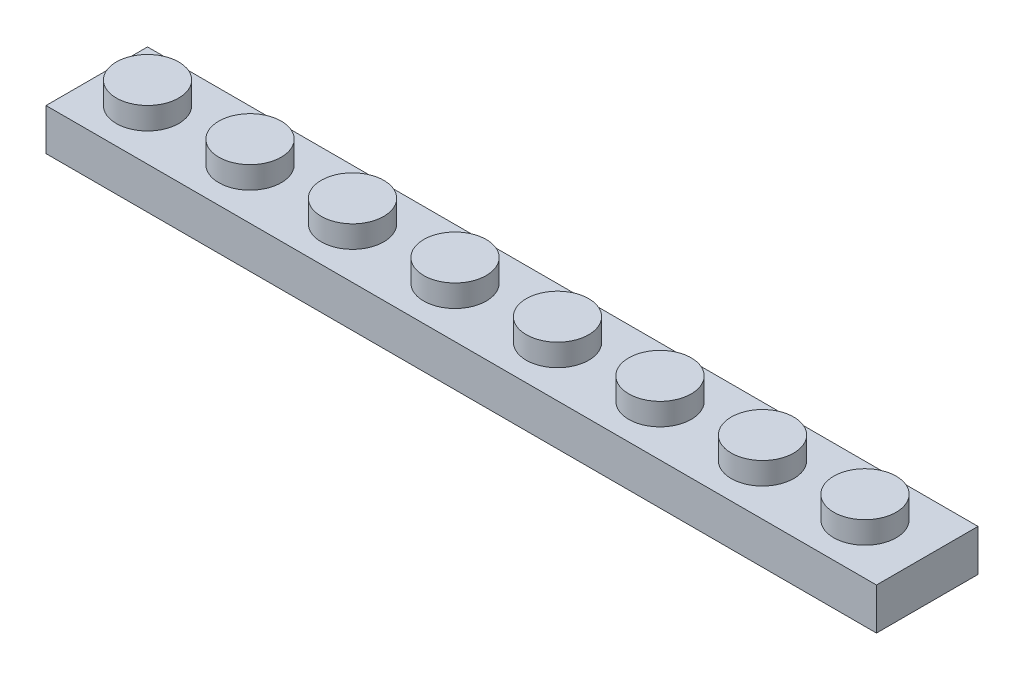
ISO-10303-21;
HEADER;
FILE_DESCRIPTION(('STEP AP214'),'2;1');
FILE_NAME('part.step','',(''),(''),'','','');
FILE_SCHEMA(('AUTOMOTIVE_DESIGN { 1 0 10303 214 1 1 1 1 }'));
ENDSEC;
DATA;
#1=APPLICATION_CONTEXT('core data for automotive mechanical design processes');
#2=APPLICATION_PROTOCOL_DEFINITION('international standard','automotive_design',2000,#1);
#3=PRODUCT_CONTEXT('',#1,'mechanical');
#4=PRODUCT('Part','Part','',(#3));
#5=PRODUCT_RELATED_PRODUCT_CATEGORY('part','',(#4));
#6=PRODUCT_DEFINITION_FORMATION('','',#4);
#7=PRODUCT_DEFINITION_CONTEXT('part definition',#1,'design');
#8=PRODUCT_DEFINITION('design','',#6,#7);
#9=PRODUCT_DEFINITION_SHAPE('','',#8);
#10=(LENGTH_UNIT() NAMED_UNIT(*) SI_UNIT(.MILLI.,.METRE.));
#11=(NAMED_UNIT(*) PLANE_ANGLE_UNIT() SI_UNIT($,.RADIAN.));
#12=(NAMED_UNIT(*) SI_UNIT($,.STERADIAN.) SOLID_ANGLE_UNIT());
#13=UNCERTAINTY_MEASURE_WITH_UNIT(LENGTH_MEASURE(1.E-05),#10,'distance_accuracy_value','');
#14=(GEOMETRIC_REPRESENTATION_CONTEXT(3) GLOBAL_UNCERTAINTY_ASSIGNED_CONTEXT((#13)) GLOBAL_UNIT_ASSIGNED_CONTEXT((#10,
#11,#12)) REPRESENTATION_CONTEXT('',''));
#15=CARTESIAN_POINT('',(0.,0.,0.));
#16=DIRECTION('',(0.,0.,1.));
#17=DIRECTION('',(1.,0.,0.));
#18=AXIS2_PLACEMENT_3D('',#15,#16,#17);
#19=CARTESIAN_POINT('',(-31.9,3.2,3.9));
#20=DIRECTION('',(1.,0.,0.));
#21=DIRECTION('',(0.,0.,-1.));
#22=AXIS2_PLACEMENT_3D('',#19,#20,#21);
#23=PLANE('',#22);
#24=DIRECTION('',(0.,0.,1.));
#25=VECTOR('',#24,1.);
#26=CARTESIAN_POINT('',(-31.9,0.,3.9));
#27=LINE('',#26,#25);
#28=CARTESIAN_POINT('',(-31.9,0.,-3.89999999999999));
#29=VERTEX_POINT('',#28);
#30=CARTESIAN_POINT('',(-31.9,0.,3.9));
#31=VERTEX_POINT('',#30);
#32=EDGE_CURVE('E96',#29,#31,#27,.T.);
#33=ORIENTED_EDGE('',*,*,#32,.T.);
#34=DIRECTION('',(0.,-1.,0.));
#35=VECTOR('',#34,1.);
#36=CARTESIAN_POINT('',(-31.9,3.2,3.9));
#37=LINE('',#36,#35);
#38=CARTESIAN_POINT('',(-31.9,3.2,3.9));
#39=VERTEX_POINT('',#38);
#40=EDGE_CURVE('E11',#39,#31,#37,.T.);
#41=ORIENTED_EDGE('',*,*,#40,.F.);
#42=DIRECTION('',(0.,0.,1.));
#43=VECTOR('',#42,1.);
#44=CARTESIAN_POINT('',(-31.9,3.2,3.9));
#45=LINE('',#44,#43);
#46=CARTESIAN_POINT('',(-31.9,3.2,-3.89999999999999));
#47=VERTEX_POINT('',#46);
#48=EDGE_CURVE('E84',#47,#39,#45,.T.);
#49=ORIENTED_EDGE('',*,*,#48,.F.);
#50=DIRECTION('',(0.,-1.,0.));
#51=VECTOR('',#50,1.);
#52=CARTESIAN_POINT('',(-31.9,3.2,-3.89999999999999));
#53=LINE('',#52,#51);
#54=EDGE_CURVE('E92',#47,#29,#53,.T.);
#55=ORIENTED_EDGE('',*,*,#54,.T.);
#56=EDGE_LOOP('',(#33,#41,#49,#55));
#57=FACE_BOUND('',#56,.T.);
#58=ADVANCED_FACE('F33',(#57),#23,.F.);
#59=CARTESIAN_POINT('',(31.9,3.2,3.9));
#60=DIRECTION('',(0.,0.,-1.));
#61=DIRECTION('',(-1.,0.,0.));
#62=AXIS2_PLACEMENT_3D('',#59,#60,#61);
#63=PLANE('',#62);
#64=DIRECTION('',(1.,0.,0.));
#65=VECTOR('',#64,1.);
#66=CARTESIAN_POINT('',(31.9,0.,3.9));
#67=LINE('',#66,#65);
#68=CARTESIAN_POINT('',(31.9,0.,3.9));
#69=VERTEX_POINT('',#68);
#70=EDGE_CURVE('E88',#31,#69,#67,.T.);
#71=ORIENTED_EDGE('',*,*,#70,.T.);
#72=DIRECTION('',(0.,-1.,0.));
#73=VECTOR('',#72,1.);
#74=CARTESIAN_POINT('',(31.9,3.2,3.9));
#75=LINE('',#74,#73);
#76=CARTESIAN_POINT('',(31.9,3.2,3.9));
#77=VERTEX_POINT('',#76);
#78=EDGE_CURVE('E41',#77,#69,#75,.T.);
#79=ORIENTED_EDGE('',*,*,#78,.F.);
#80=DIRECTION('',(1.,0.,0.));
#81=VECTOR('',#80,1.);
#82=CARTESIAN_POINT('',(31.9,3.2,3.9));
#83=LINE('',#82,#81);
#84=EDGE_CURVE('E79',#39,#77,#83,.T.);
#85=ORIENTED_EDGE('',*,*,#84,.F.);
#86=ORIENTED_EDGE('',*,*,#40,.T.);
#87=EDGE_LOOP('',(#71,#79,#85,#86));
#88=FACE_BOUND('',#87,.T.);
#89=ADVANCED_FACE('F87',(#88),#63,.F.);
#90=CARTESIAN_POINT('',(31.9,3.2,3.9));
#91=DIRECTION('',(-1.,0.,0.));
#92=DIRECTION('',(0.,0.,1.));
#93=AXIS2_PLACEMENT_3D('',#90,#91,#92);
#94=PLANE('',#93);
#95=DIRECTION('',(0.,0.,-1.));
#96=VECTOR('',#95,1.);
#97=CARTESIAN_POINT('',(31.9,0.,3.9));
#98=LINE('',#97,#96);
#99=CARTESIAN_POINT('',(31.9,0.,-3.9));
#100=VERTEX_POINT('',#99);
#101=EDGE_CURVE('E66',#69,#100,#98,.T.);
#102=ORIENTED_EDGE('',*,*,#101,.T.);
#103=DIRECTION('',(0.,-1.,0.));
#104=VECTOR('',#103,1.);
#105=CARTESIAN_POINT('',(31.9,3.2,-3.9));
#106=LINE('',#105,#104);
#107=CARTESIAN_POINT('',(31.9,3.2,-3.9));
#108=VERTEX_POINT('',#107);
#109=EDGE_CURVE('E89',#108,#100,#106,.T.);
#110=ORIENTED_EDGE('',*,*,#109,.F.);
#111=DIRECTION('',(0.,0.,-1.));
#112=VECTOR('',#111,1.);
#113=CARTESIAN_POINT('',(31.9,3.2,3.9));
#114=LINE('',#113,#112);
#115=EDGE_CURVE('E82',#77,#108,#114,.T.);
#116=ORIENTED_EDGE('',*,*,#115,.F.);
#117=ORIENTED_EDGE('',*,*,#78,.T.);
#118=EDGE_LOOP('',(#102,#110,#116,#117));
#119=FACE_BOUND('',#118,.T.);
#120=ADVANCED_FACE('F90',(#119),#94,.F.);
#121=CARTESIAN_POINT('',(31.9,3.2,-3.9));
#122=DIRECTION('',(0.,0.,1.));
#123=DIRECTION('',(1.,0.,0.));
#124=AXIS2_PLACEMENT_3D('',#121,#122,#123);
#125=PLANE('',#124);
#126=DIRECTION('',(-1.,0.,0.));
#127=VECTOR('',#126,1.);
#128=CARTESIAN_POINT('',(31.9,0.,-3.9));
#129=LINE('',#128,#127);
#130=EDGE_CURVE('E72',#100,#29,#129,.T.);
#131=ORIENTED_EDGE('',*,*,#130,.T.);
#132=ORIENTED_EDGE('',*,*,#54,.F.);
#133=DIRECTION('',(-1.,0.,0.));
#134=VECTOR('',#133,1.);
#135=CARTESIAN_POINT('',(31.9,3.2,-3.9));
#136=LINE('',#135,#134);
#137=EDGE_CURVE('E49',#108,#47,#136,.T.);
#138=ORIENTED_EDGE('',*,*,#137,.F.);
#139=ORIENTED_EDGE('',*,*,#109,.T.);
#140=EDGE_LOOP('',(#131,#132,#138,#139));
#141=FACE_BOUND('',#140,.T.);
#142=ADVANCED_FACE('F104',(#141),#125,.F.);
#143=CARTESIAN_POINT('',(0.,3.2,0.));
#144=DIRECTION('',(0.,1.,0.));
#145=DIRECTION('',(0.,0.,1.));
#146=AXIS2_PLACEMENT_3D('',#143,#144,#145);
#147=PLANE('',#146);
#148=CARTESIAN_POINT('',(27.118,3.2,0.));
#149=DIRECTION('',(0.,1.,0.));
#150=DIRECTION('',(0.,0.,1.));
#151=AXIS2_PLACEMENT_3D('',#148,#149,#150);
#152=CIRCLE('',#151,2.4);
#153=CARTESIAN_POINT('',(27.118,3.2,2.4));
#154=VERTEX_POINT('',#153);
#155=EDGE_CURVE('E152',#154,#154,#152,.T.);
#156=ORIENTED_EDGE('',*,*,#155,.F.);
#157=EDGE_LOOP('',(#156));
#158=FACE_BOUND('',#157,.T.);
#159=CARTESIAN_POINT('',(19.244,3.2,0.));
#160=DIRECTION('',(0.,1.,0.));
#161=DIRECTION('',(0.,0.,1.));
#162=AXIS2_PLACEMENT_3D('',#159,#160,#161);
#163=CIRCLE('',#162,2.4);
#164=CARTESIAN_POINT('',(19.244,3.2,2.4));
#165=VERTEX_POINT('',#164);
#166=EDGE_CURVE('E146',#165,#165,#163,.T.);
#167=ORIENTED_EDGE('',*,*,#166,.F.);
#168=EDGE_LOOP('',(#167));
#169=FACE_BOUND('',#168,.T.);
#170=CARTESIAN_POINT('',(11.37,3.2,0.));
#171=DIRECTION('',(0.,1.,0.));
#172=DIRECTION('',(0.,0.,1.));
#173=AXIS2_PLACEMENT_3D('',#170,#171,#172);
#174=CIRCLE('',#173,2.4);
#175=CARTESIAN_POINT('',(11.37,3.2,2.4));
#176=VERTEX_POINT('',#175);
#177=EDGE_CURVE('E140',#176,#176,#174,.T.);
#178=ORIENTED_EDGE('',*,*,#177,.F.);
#179=EDGE_LOOP('',(#178));
#180=FACE_BOUND('',#179,.T.);
#181=CARTESIAN_POINT('',(3.49600000000003,3.2,0.));
#182=DIRECTION('',(0.,1.,0.));
#183=DIRECTION('',(0.,0.,1.));
#184=AXIS2_PLACEMENT_3D('',#181,#182,#183);
#185=CIRCLE('',#184,2.4);
#186=CARTESIAN_POINT('',(3.49600000000003,3.2,2.4));
#187=VERTEX_POINT('',#186);
#188=EDGE_CURVE('E134',#187,#187,#185,.T.);
#189=ORIENTED_EDGE('',*,*,#188,.F.);
#190=EDGE_LOOP('',(#189));
#191=FACE_BOUND('',#190,.T.);
#192=CARTESIAN_POINT('',(-4.37799999999997,3.2,0.));
#193=DIRECTION('',(0.,1.,0.));
#194=DIRECTION('',(0.,0.,1.));
#195=AXIS2_PLACEMENT_3D('',#192,#193,#194);
#196=CIRCLE('',#195,2.4);
#197=CARTESIAN_POINT('',(-4.37799999999997,3.2,2.4));
#198=VERTEX_POINT('',#197);
#199=EDGE_CURVE('E128',#198,#198,#196,.T.);
#200=ORIENTED_EDGE('',*,*,#199,.F.);
#201=EDGE_LOOP('',(#200));
#202=FACE_BOUND('',#201,.T.);
#203=CARTESIAN_POINT('',(-12.252,3.2,0.));
#204=DIRECTION('',(0.,1.,0.));
#205=DIRECTION('',(0.,0.,1.));
#206=AXIS2_PLACEMENT_3D('',#203,#204,#205);
#207=CIRCLE('',#206,2.4);
#208=CARTESIAN_POINT('',(-12.252,3.2,2.4));
#209=VERTEX_POINT('',#208);
#210=EDGE_CURVE('E122',#209,#209,#207,.T.);
#211=ORIENTED_EDGE('',*,*,#210,.F.);
#212=EDGE_LOOP('',(#211));
#213=FACE_BOUND('',#212,.T.);
#214=CARTESIAN_POINT('',(-20.126,3.2,0.));
#215=DIRECTION('',(0.,1.,0.));
#216=DIRECTION('',(0.,0.,1.));
#217=AXIS2_PLACEMENT_3D('',#214,#215,#216);
#218=CIRCLE('',#217,2.4);
#219=CARTESIAN_POINT('',(-20.126,3.2,2.4));
#220=VERTEX_POINT('',#219);
#221=EDGE_CURVE('E116',#220,#220,#218,.T.);
#222=ORIENTED_EDGE('',*,*,#221,.F.);
#223=EDGE_LOOP('',(#222));
#224=FACE_BOUND('',#223,.T.);
#225=CARTESIAN_POINT('',(-28.,3.2,0.));
#226=DIRECTION('',(0.,1.,0.));
#227=DIRECTION('',(0.,0.,1.));
#228=AXIS2_PLACEMENT_3D('',#225,#226,#227);
#229=CIRCLE('',#228,2.4);
#230=CARTESIAN_POINT('',(-28.,3.2,2.4));
#231=VERTEX_POINT('',#230);
#232=EDGE_CURVE('E110',#231,#231,#229,.T.);
#233=ORIENTED_EDGE('',*,*,#232,.F.);
#234=EDGE_LOOP('',(#233));
#235=FACE_BOUND('',#234,.T.);
#236=ORIENTED_EDGE('',*,*,#48,.T.);
#237=ORIENTED_EDGE('',*,*,#84,.T.);
#238=ORIENTED_EDGE('',*,*,#115,.T.);
#239=ORIENTED_EDGE('',*,*,#137,.T.);
#240=EDGE_LOOP('',(#236,#237,#238,#239));
#241=FACE_BOUND('',#240,.T.);
#242=ADVANCED_FACE('F80',(#158,#169,#180,#191,#202,#213,#224,#235,#241),#147,.T.);
#243=CARTESIAN_POINT('',(0.,0.,0.));
#244=DIRECTION('',(0.,1.,0.));
#245=DIRECTION('',(0.,0.,1.));
#246=AXIS2_PLACEMENT_3D('',#243,#244,#245);
#247=PLANE('',#246);
#248=CARTESIAN_POINT('',(-28.,0.,0.));
#249=DIRECTION('',(0.,-1.,0.));
#250=DIRECTION('',(0.,0.,-1.));
#251=AXIS2_PLACEMENT_3D('',#248,#249,#250);
#252=CIRCLE('',#251,2.5);
#253=CARTESIAN_POINT('',(-28.,0.,-2.5));
#254=VERTEX_POINT('',#253);
#255=EDGE_CURVE('E200',#254,#254,#252,.T.);
#256=ORIENTED_EDGE('',*,*,#255,.F.);
#257=EDGE_LOOP('',(#256));
#258=FACE_BOUND('',#257,.T.);
#259=CARTESIAN_POINT('',(-20.126,0.,0.));
#260=DIRECTION('',(0.,-1.,0.));
#261=DIRECTION('',(0.,0.,-1.));
#262=AXIS2_PLACEMENT_3D('',#259,#260,#261);
#263=CIRCLE('',#262,2.5);
#264=CARTESIAN_POINT('',(-20.126,0.,-2.5));
#265=VERTEX_POINT('',#264);
#266=EDGE_CURVE('E194',#265,#265,#263,.T.);
#267=ORIENTED_EDGE('',*,*,#266,.F.);
#268=EDGE_LOOP('',(#267));
#269=FACE_BOUND('',#268,.T.);
#270=CARTESIAN_POINT('',(-12.252,0.,0.));
#271=DIRECTION('',(0.,-1.,0.));
#272=DIRECTION('',(0.,0.,-1.));
#273=AXIS2_PLACEMENT_3D('',#270,#271,#272);
#274=CIRCLE('',#273,2.5);
#275=CARTESIAN_POINT('',(-12.252,0.,-2.5));
#276=VERTEX_POINT('',#275);
#277=EDGE_CURVE('E188',#276,#276,#274,.T.);
#278=ORIENTED_EDGE('',*,*,#277,.F.);
#279=EDGE_LOOP('',(#278));
#280=FACE_BOUND('',#279,.T.);
#281=CARTESIAN_POINT('',(-4.37799999999997,0.,0.));
#282=DIRECTION('',(0.,-1.,0.));
#283=DIRECTION('',(0.,0.,-1.));
#284=AXIS2_PLACEMENT_3D('',#281,#282,#283);
#285=CIRCLE('',#284,2.5);
#286=CARTESIAN_POINT('',(-4.37799999999997,0.,-2.5));
#287=VERTEX_POINT('',#286);
#288=EDGE_CURVE('E182',#287,#287,#285,.T.);
#289=ORIENTED_EDGE('',*,*,#288,.F.);
#290=EDGE_LOOP('',(#289));
#291=FACE_BOUND('',#290,.T.);
#292=CARTESIAN_POINT('',(3.49600000000003,0.,0.));
#293=DIRECTION('',(0.,-1.,0.));
#294=DIRECTION('',(0.,0.,-1.));
#295=AXIS2_PLACEMENT_3D('',#292,#293,#294);
#296=CIRCLE('',#295,2.5);
#297=CARTESIAN_POINT('',(3.49600000000003,0.,-2.5));
#298=VERTEX_POINT('',#297);
#299=EDGE_CURVE('E176',#298,#298,#296,.T.);
#300=ORIENTED_EDGE('',*,*,#299,.F.);
#301=EDGE_LOOP('',(#300));
#302=FACE_BOUND('',#301,.T.);
#303=CARTESIAN_POINT('',(11.37,0.,0.));
#304=DIRECTION('',(0.,-1.,0.));
#305=DIRECTION('',(0.,0.,-1.));
#306=AXIS2_PLACEMENT_3D('',#303,#304,#305);
#307=CIRCLE('',#306,2.5);
#308=CARTESIAN_POINT('',(11.37,0.,-2.5));
#309=VERTEX_POINT('',#308);
#310=EDGE_CURVE('E170',#309,#309,#307,.T.);
#311=ORIENTED_EDGE('',*,*,#310,.F.);
#312=EDGE_LOOP('',(#311));
#313=FACE_BOUND('',#312,.T.);
#314=CARTESIAN_POINT('',(19.244,0.,0.));
#315=DIRECTION('',(0.,-1.,0.));
#316=DIRECTION('',(0.,0.,-1.));
#317=AXIS2_PLACEMENT_3D('',#314,#315,#316);
#318=CIRCLE('',#317,2.5);
#319=CARTESIAN_POINT('',(19.244,0.,-2.5));
#320=VERTEX_POINT('',#319);
#321=EDGE_CURVE('E164',#320,#320,#318,.T.);
#322=ORIENTED_EDGE('',*,*,#321,.F.);
#323=EDGE_LOOP('',(#322));
#324=FACE_BOUND('',#323,.T.);
#325=CARTESIAN_POINT('',(27.118,0.,0.));
#326=DIRECTION('',(0.,-1.,0.));
#327=DIRECTION('',(0.,0.,-1.));
#328=AXIS2_PLACEMENT_3D('',#325,#326,#327);
#329=CIRCLE('',#328,2.5);
#330=CARTESIAN_POINT('',(27.118,0.,-2.5));
#331=VERTEX_POINT('',#330);
#332=EDGE_CURVE('E158',#331,#331,#329,.T.);
#333=ORIENTED_EDGE('',*,*,#332,.F.);
#334=EDGE_LOOP('',(#333));
#335=FACE_BOUND('',#334,.T.);
#336=ORIENTED_EDGE('',*,*,#32,.F.);
#337=ORIENTED_EDGE('',*,*,#130,.F.);
#338=ORIENTED_EDGE('',*,*,#101,.F.);
#339=ORIENTED_EDGE('',*,*,#70,.F.);
#340=EDGE_LOOP('',(#336,#337,#338,#339));
#341=FACE_BOUND('',#340,.T.);
#342=ADVANCED_FACE('F107',(#258,#269,#280,#291,#302,#313,#324,#335,#341),#247,.F.);
#343=CARTESIAN_POINT('',(-28.,4.9,0.));
#344=DIRECTION('',(0.,-1.,0.));
#345=DIRECTION('',(0.,0.,-1.));
#346=AXIS2_PLACEMENT_3D('',#343,#344,#345);
#347=CYLINDRICAL_SURFACE('',#346,2.4);
#348=CARTESIAN_POINT('',(-28.,4.9,0.));
#349=DIRECTION('',(0.,1.,0.));
#350=DIRECTION('',(0.,0.,1.));
#351=AXIS2_PLACEMENT_3D('',#348,#349,#350);
#352=CIRCLE('',#351,2.4);
#353=CARTESIAN_POINT('',(-28.,4.9,2.4));
#354=VERTEX_POINT('',#353);
#355=EDGE_CURVE('E99',#354,#354,#352,.T.);
#356=ORIENTED_EDGE('',*,*,#355,.F.);
#357=EDGE_LOOP('',(#356));
#358=FACE_BOUND('',#357,.T.);
#359=ORIENTED_EDGE('',*,*,#232,.T.);
#360=EDGE_LOOP('',(#359));
#361=FACE_BOUND('',#360,.T.);
#362=ADVANCED_FACE('F217',(#358,#361),#347,.T.);
#363=CARTESIAN_POINT('',(-28.,4.9,0.));
#364=DIRECTION('',(0.,1.,0.));
#365=DIRECTION('',(0.,0.,1.));
#366=AXIS2_PLACEMENT_3D('',#363,#364,#365);
#367=PLANE('',#366);
#368=ORIENTED_EDGE('',*,*,#355,.T.);
#369=EDGE_LOOP('',(#368));
#370=FACE_BOUND('',#369,.T.);
#371=ADVANCED_FACE('F266',(#370),#367,.T.);
#372=CARTESIAN_POINT('',(-20.126,4.9,0.));
#373=DIRECTION('',(0.,-1.,0.));
#374=DIRECTION('',(0.,0.,-1.));
#375=AXIS2_PLACEMENT_3D('',#372,#373,#374);
#376=CYLINDRICAL_SURFACE('',#375,2.4);
#377=CARTESIAN_POINT('',(-20.126,4.9,0.));
#378=DIRECTION('',(0.,1.,0.));
#379=DIRECTION('',(0.,0.,1.));
#380=AXIS2_PLACEMENT_3D('',#377,#378,#379);
#381=CIRCLE('',#380,2.4);
#382=CARTESIAN_POINT('',(-20.126,4.9,2.4));
#383=VERTEX_POINT('',#382);
#384=EDGE_CURVE('E113',#383,#383,#381,.T.);
#385=ORIENTED_EDGE('',*,*,#384,.F.);
#386=EDGE_LOOP('',(#385));
#387=FACE_BOUND('',#386,.T.);
#388=ORIENTED_EDGE('',*,*,#221,.T.);
#389=EDGE_LOOP('',(#388));
#390=FACE_BOUND('',#389,.T.);
#391=ADVANCED_FACE('F270',(#387,#390),#376,.T.);
#392=CARTESIAN_POINT('',(-20.126,4.9,0.));
#393=DIRECTION('',(0.,1.,0.));
#394=DIRECTION('',(0.,0.,1.));
#395=AXIS2_PLACEMENT_3D('',#392,#393,#394);
#396=PLANE('',#395);
#397=ORIENTED_EDGE('',*,*,#384,.T.);
#398=EDGE_LOOP('',(#397));
#399=FACE_BOUND('',#398,.T.);
#400=ADVANCED_FACE('F274',(#399),#396,.T.);
#401=CARTESIAN_POINT('',(-12.252,4.9,0.));
#402=DIRECTION('',(0.,-1.,0.));
#403=DIRECTION('',(0.,0.,-1.));
#404=AXIS2_PLACEMENT_3D('',#401,#402,#403);
#405=CYLINDRICAL_SURFACE('',#404,2.4);
#406=CARTESIAN_POINT('',(-12.252,4.9,0.));
#407=DIRECTION('',(0.,1.,0.));
#408=DIRECTION('',(0.,0.,1.));
#409=AXIS2_PLACEMENT_3D('',#406,#407,#408);
#410=CIRCLE('',#409,2.4);
#411=CARTESIAN_POINT('',(-12.252,4.9,2.4));
#412=VERTEX_POINT('',#411);
#413=EDGE_CURVE('E119',#412,#412,#410,.T.);
#414=ORIENTED_EDGE('',*,*,#413,.F.);
#415=EDGE_LOOP('',(#414));
#416=FACE_BOUND('',#415,.T.);
#417=ORIENTED_EDGE('',*,*,#210,.T.);
#418=EDGE_LOOP('',(#417));
#419=FACE_BOUND('',#418,.T.);
#420=ADVANCED_FACE('F278',(#416,#419),#405,.T.);
#421=CARTESIAN_POINT('',(-12.252,4.9,0.));
#422=DIRECTION('',(0.,1.,0.));
#423=DIRECTION('',(0.,0.,1.));
#424=AXIS2_PLACEMENT_3D('',#421,#422,#423);
#425=PLANE('',#424);
#426=ORIENTED_EDGE('',*,*,#413,.T.);
#427=EDGE_LOOP('',(#426));
#428=FACE_BOUND('',#427,.T.);
#429=ADVANCED_FACE('F282',(#428),#425,.T.);
#430=CARTESIAN_POINT('',(-4.37799999999997,4.9,0.));
#431=DIRECTION('',(0.,-1.,0.));
#432=DIRECTION('',(0.,0.,-1.));
#433=AXIS2_PLACEMENT_3D('',#430,#431,#432);
#434=CYLINDRICAL_SURFACE('',#433,2.4);
#435=CARTESIAN_POINT('',(-4.37799999999997,4.9,0.));
#436=DIRECTION('',(0.,1.,0.));
#437=DIRECTION('',(0.,0.,1.));
#438=AXIS2_PLACEMENT_3D('',#435,#436,#437);
#439=CIRCLE('',#438,2.4);
#440=CARTESIAN_POINT('',(-4.37799999999997,4.9,2.4));
#441=VERTEX_POINT('',#440);
#442=EDGE_CURVE('E125',#441,#441,#439,.T.);
#443=ORIENTED_EDGE('',*,*,#442,.F.);
#444=EDGE_LOOP('',(#443));
#445=FACE_BOUND('',#444,.T.);
#446=ORIENTED_EDGE('',*,*,#199,.T.);
#447=EDGE_LOOP('',(#446));
#448=FACE_BOUND('',#447,.T.);
#449=ADVANCED_FACE('F286',(#445,#448),#434,.T.);
#450=CARTESIAN_POINT('',(-4.37799999999997,4.9,0.));
#451=DIRECTION('',(0.,1.,0.));
#452=DIRECTION('',(0.,0.,1.));
#453=AXIS2_PLACEMENT_3D('',#450,#451,#452);
#454=PLANE('',#453);
#455=ORIENTED_EDGE('',*,*,#442,.T.);
#456=EDGE_LOOP('',(#455));
#457=FACE_BOUND('',#456,.T.);
#458=ADVANCED_FACE('F290',(#457),#454,.T.);
#459=CARTESIAN_POINT('',(3.49600000000003,4.9,0.));
#460=DIRECTION('',(0.,-1.,0.));
#461=DIRECTION('',(0.,0.,-1.));
#462=AXIS2_PLACEMENT_3D('',#459,#460,#461);
#463=CYLINDRICAL_SURFACE('',#462,2.4);
#464=CARTESIAN_POINT('',(3.49600000000003,4.9,0.));
#465=DIRECTION('',(0.,1.,0.));
#466=DIRECTION('',(0.,0.,1.));
#467=AXIS2_PLACEMENT_3D('',#464,#465,#466);
#468=CIRCLE('',#467,2.4);
#469=CARTESIAN_POINT('',(3.49600000000003,4.9,2.4));
#470=VERTEX_POINT('',#469);
#471=EDGE_CURVE('E131',#470,#470,#468,.T.);
#472=ORIENTED_EDGE('',*,*,#471,.F.);
#473=EDGE_LOOP('',(#472));
#474=FACE_BOUND('',#473,.T.);
#475=ORIENTED_EDGE('',*,*,#188,.T.);
#476=EDGE_LOOP('',(#475));
#477=FACE_BOUND('',#476,.T.);
#478=ADVANCED_FACE('F294',(#474,#477),#463,.T.);
#479=CARTESIAN_POINT('',(3.49600000000003,4.9,0.));
#480=DIRECTION('',(0.,1.,0.));
#481=DIRECTION('',(0.,0.,1.));
#482=AXIS2_PLACEMENT_3D('',#479,#480,#481);
#483=PLANE('',#482);
#484=ORIENTED_EDGE('',*,*,#471,.T.);
#485=EDGE_LOOP('',(#484));
#486=FACE_BOUND('',#485,.T.);
#487=ADVANCED_FACE('F298',(#486),#483,.T.);
#488=CARTESIAN_POINT('',(11.37,4.9,0.));
#489=DIRECTION('',(0.,-1.,0.));
#490=DIRECTION('',(0.,0.,-1.));
#491=AXIS2_PLACEMENT_3D('',#488,#489,#490);
#492=CYLINDRICAL_SURFACE('',#491,2.4);
#493=CARTESIAN_POINT('',(11.37,4.9,0.));
#494=DIRECTION('',(0.,1.,0.));
#495=DIRECTION('',(0.,0.,1.));
#496=AXIS2_PLACEMENT_3D('',#493,#494,#495);
#497=CIRCLE('',#496,2.4);
#498=CARTESIAN_POINT('',(11.37,4.9,2.4));
#499=VERTEX_POINT('',#498);
#500=EDGE_CURVE('E137',#499,#499,#497,.T.);
#501=ORIENTED_EDGE('',*,*,#500,.F.);
#502=EDGE_LOOP('',(#501));
#503=FACE_BOUND('',#502,.T.);
#504=ORIENTED_EDGE('',*,*,#177,.T.);
#505=EDGE_LOOP('',(#504));
#506=FACE_BOUND('',#505,.T.);
#507=ADVANCED_FACE('F302',(#503,#506),#492,.T.);
#508=CARTESIAN_POINT('',(11.37,4.9,0.));
#509=DIRECTION('',(0.,1.,0.));
#510=DIRECTION('',(0.,0.,1.));
#511=AXIS2_PLACEMENT_3D('',#508,#509,#510);
#512=PLANE('',#511);
#513=ORIENTED_EDGE('',*,*,#500,.T.);
#514=EDGE_LOOP('',(#513));
#515=FACE_BOUND('',#514,.T.);
#516=ADVANCED_FACE('F306',(#515),#512,.T.);
#517=CARTESIAN_POINT('',(19.244,4.9,0.));
#518=DIRECTION('',(0.,-1.,0.));
#519=DIRECTION('',(0.,0.,-1.));
#520=AXIS2_PLACEMENT_3D('',#517,#518,#519);
#521=CYLINDRICAL_SURFACE('',#520,2.4);
#522=CARTESIAN_POINT('',(19.244,4.9,0.));
#523=DIRECTION('',(0.,1.,0.));
#524=DIRECTION('',(0.,0.,1.));
#525=AXIS2_PLACEMENT_3D('',#522,#523,#524);
#526=CIRCLE('',#525,2.4);
#527=CARTESIAN_POINT('',(19.244,4.9,2.4));
#528=VERTEX_POINT('',#527);
#529=EDGE_CURVE('E143',#528,#528,#526,.T.);
#530=ORIENTED_EDGE('',*,*,#529,.F.);
#531=EDGE_LOOP('',(#530));
#532=FACE_BOUND('',#531,.T.);
#533=ORIENTED_EDGE('',*,*,#166,.T.);
#534=EDGE_LOOP('',(#533));
#535=FACE_BOUND('',#534,.T.);
#536=ADVANCED_FACE('F310',(#532,#535),#521,.T.);
#537=CARTESIAN_POINT('',(19.244,4.9,0.));
#538=DIRECTION('',(0.,1.,0.));
#539=DIRECTION('',(0.,0.,1.));
#540=AXIS2_PLACEMENT_3D('',#537,#538,#539);
#541=PLANE('',#540);
#542=ORIENTED_EDGE('',*,*,#529,.T.);
#543=EDGE_LOOP('',(#542));
#544=FACE_BOUND('',#543,.T.);
#545=ADVANCED_FACE('F314',(#544),#541,.T.);
#546=CARTESIAN_POINT('',(27.118,4.9,0.));
#547=DIRECTION('',(0.,-1.,0.));
#548=DIRECTION('',(0.,0.,-1.));
#549=AXIS2_PLACEMENT_3D('',#546,#547,#548);
#550=CYLINDRICAL_SURFACE('',#549,2.4);
#551=CARTESIAN_POINT('',(27.118,4.9,0.));
#552=DIRECTION('',(0.,1.,0.));
#553=DIRECTION('',(0.,0.,1.));
#554=AXIS2_PLACEMENT_3D('',#551,#552,#553);
#555=CIRCLE('',#554,2.4);
#556=CARTESIAN_POINT('',(27.118,4.9,2.4));
#557=VERTEX_POINT('',#556);
#558=EDGE_CURVE('E149',#557,#557,#555,.T.);
#559=ORIENTED_EDGE('',*,*,#558,.F.);
#560=EDGE_LOOP('',(#559));
#561=FACE_BOUND('',#560,.T.);
#562=ORIENTED_EDGE('',*,*,#155,.T.);
#563=EDGE_LOOP('',(#562));
#564=FACE_BOUND('',#563,.T.);
#565=ADVANCED_FACE('F246',(#561,#564),#550,.T.);
#566=CARTESIAN_POINT('',(27.118,4.9,0.));
#567=DIRECTION('',(0.,1.,0.));
#568=DIRECTION('',(0.,0.,1.));
#569=AXIS2_PLACEMENT_3D('',#566,#567,#568);
#570=PLANE('',#569);
#571=ORIENTED_EDGE('',*,*,#558,.T.);
#572=EDGE_LOOP('',(#571));
#573=FACE_BOUND('',#572,.T.);
#574=ADVANCED_FACE('F236',(#573),#570,.T.);
#575=CARTESIAN_POINT('',(27.118,1.8,0.));
#576=DIRECTION('',(0.,-1.,0.));
#577=DIRECTION('',(0.,0.,-1.));
#578=AXIS2_PLACEMENT_3D('',#575,#576,#577);
#579=CYLINDRICAL_SURFACE('',#578,2.5);
#580=CARTESIAN_POINT('',(27.118,1.8,0.));
#581=DIRECTION('',(0.,-1.,0.));
#582=DIRECTION('',(0.,0.,-1.));
#583=AXIS2_PLACEMENT_3D('',#580,#581,#582);
#584=CIRCLE('',#583,2.5);
#585=CARTESIAN_POINT('',(27.118,1.8,-2.5));
#586=VERTEX_POINT('',#585);
#587=EDGE_CURVE('E161',#586,#586,#584,.T.);
#588=ORIENTED_EDGE('',*,*,#587,.F.);
#589=EDGE_LOOP('',(#588));
#590=FACE_BOUND('',#589,.T.);
#591=ORIENTED_EDGE('',*,*,#332,.T.);
#592=EDGE_LOOP('',(#591));
#593=FACE_BOUND('',#592,.T.);
#594=ADVANCED_FACE('F233',(#590,#593),#579,.F.);
#595=CARTESIAN_POINT('',(27.118,1.8,0.));
#596=DIRECTION('',(0.,-1.,0.));
#597=DIRECTION('',(0.,0.,-1.));
#598=AXIS2_PLACEMENT_3D('',#595,#596,#597);
#599=PLANE('',#598);
#600=ORIENTED_EDGE('',*,*,#587,.T.);
#601=EDGE_LOOP('',(#600));
#602=FACE_BOUND('',#601,.T.);
#603=ADVANCED_FACE('F235',(#602),#599,.T.);
#604=CARTESIAN_POINT('',(19.244,1.8,0.));
#605=DIRECTION('',(0.,-1.,0.));
#606=DIRECTION('',(0.,0.,-1.));
#607=AXIS2_PLACEMENT_3D('',#604,#605,#606);
#608=CYLINDRICAL_SURFACE('',#607,2.5);
#609=CARTESIAN_POINT('',(19.244,1.8,0.));
#610=DIRECTION('',(0.,-1.,0.));
#611=DIRECTION('',(0.,0.,-1.));
#612=AXIS2_PLACEMENT_3D('',#609,#610,#611);
#613=CIRCLE('',#612,2.5);
#614=CARTESIAN_POINT('',(19.244,1.8,-2.5));
#615=VERTEX_POINT('',#614);
#616=EDGE_CURVE('E167',#615,#615,#613,.T.);
#617=ORIENTED_EDGE('',*,*,#616,.F.);
#618=EDGE_LOOP('',(#617));
#619=FACE_BOUND('',#618,.T.);
#620=ORIENTED_EDGE('',*,*,#321,.T.);
#621=EDGE_LOOP('',(#620));
#622=FACE_BOUND('',#621,.T.);
#623=ADVANCED_FACE('F243',(#619,#622),#608,.F.);
#624=CARTESIAN_POINT('',(19.244,1.8,0.));
#625=DIRECTION('',(0.,-1.,0.));
#626=DIRECTION('',(0.,0.,-1.));
#627=AXIS2_PLACEMENT_3D('',#624,#625,#626);
#628=PLANE('',#627);
#629=ORIENTED_EDGE('',*,*,#616,.T.);
#630=EDGE_LOOP('',(#629));
#631=FACE_BOUND('',#630,.T.);
#632=ADVANCED_FACE('F380',(#631),#628,.T.);
#633=CARTESIAN_POINT('',(11.37,1.8,0.));
#634=DIRECTION('',(0.,-1.,0.));
#635=DIRECTION('',(0.,0.,-1.));
#636=AXIS2_PLACEMENT_3D('',#633,#634,#635);
#637=CYLINDRICAL_SURFACE('',#636,2.5);
#638=CARTESIAN_POINT('',(11.37,1.8,0.));
#639=DIRECTION('',(0.,-1.,0.));
#640=DIRECTION('',(0.,0.,-1.));
#641=AXIS2_PLACEMENT_3D('',#638,#639,#640);
#642=CIRCLE('',#641,2.5);
#643=CARTESIAN_POINT('',(11.37,1.8,-2.5));
#644=VERTEX_POINT('',#643);
#645=EDGE_CURVE('E173',#644,#644,#642,.T.);
#646=ORIENTED_EDGE('',*,*,#645,.F.);
#647=EDGE_LOOP('',(#646));
#648=FACE_BOUND('',#647,.T.);
#649=ORIENTED_EDGE('',*,*,#310,.T.);
#650=EDGE_LOOP('',(#649));
#651=FACE_BOUND('',#650,.T.);
#652=ADVANCED_FACE('F390',(#648,#651),#637,.F.);
#653=CARTESIAN_POINT('',(11.37,1.8,0.));
#654=DIRECTION('',(0.,-1.,0.));
#655=DIRECTION('',(0.,0.,-1.));
#656=AXIS2_PLACEMENT_3D('',#653,#654,#655);
#657=PLANE('',#656);
#658=ORIENTED_EDGE('',*,*,#645,.T.);
#659=EDGE_LOOP('',(#658));
#660=FACE_BOUND('',#659,.T.);
#661=ADVANCED_FACE('F400',(#660),#657,.T.);
#662=CARTESIAN_POINT('',(3.49600000000003,1.8,0.));
#663=DIRECTION('',(0.,-1.,0.));
#664=DIRECTION('',(0.,0.,-1.));
#665=AXIS2_PLACEMENT_3D('',#662,#663,#664);
#666=CYLINDRICAL_SURFACE('',#665,2.5);
#667=CARTESIAN_POINT('',(3.49600000000003,1.8,0.));
#668=DIRECTION('',(0.,-1.,0.));
#669=DIRECTION('',(0.,0.,-1.));
#670=AXIS2_PLACEMENT_3D('',#667,#668,#669);
#671=CIRCLE('',#670,2.5);
#672=CARTESIAN_POINT('',(3.49600000000003,1.8,-2.5));
#673=VERTEX_POINT('',#672);
#674=EDGE_CURVE('E179',#673,#673,#671,.T.);
#675=ORIENTED_EDGE('',*,*,#674,.F.);
#676=EDGE_LOOP('',(#675));
#677=FACE_BOUND('',#676,.T.);
#678=ORIENTED_EDGE('',*,*,#299,.T.);
#679=EDGE_LOOP('',(#678));
#680=FACE_BOUND('',#679,.T.);
#681=ADVANCED_FACE('F410',(#677,#680),#666,.F.);
#682=CARTESIAN_POINT('',(3.49600000000003,1.8,0.));
#683=DIRECTION('',(0.,-1.,0.));
#684=DIRECTION('',(0.,0.,-1.));
#685=AXIS2_PLACEMENT_3D('',#682,#683,#684);
#686=PLANE('',#685);
#687=ORIENTED_EDGE('',*,*,#674,.T.);
#688=EDGE_LOOP('',(#687));
#689=FACE_BOUND('',#688,.T.);
#690=ADVANCED_FACE('F420',(#689),#686,.T.);
#691=CARTESIAN_POINT('',(-4.37799999999997,1.8,0.));
#692=DIRECTION('',(0.,-1.,0.));
#693=DIRECTION('',(0.,0.,-1.));
#694=AXIS2_PLACEMENT_3D('',#691,#692,#693);
#695=CYLINDRICAL_SURFACE('',#694,2.5);
#696=CARTESIAN_POINT('',(-4.37799999999997,1.8,0.));
#697=DIRECTION('',(0.,-1.,0.));
#698=DIRECTION('',(0.,0.,-1.));
#699=AXIS2_PLACEMENT_3D('',#696,#697,#698);
#700=CIRCLE('',#699,2.5);
#701=CARTESIAN_POINT('',(-4.37799999999997,1.8,-2.5));
#702=VERTEX_POINT('',#701);
#703=EDGE_CURVE('E185',#702,#702,#700,.T.);
#704=ORIENTED_EDGE('',*,*,#703,.F.);
#705=EDGE_LOOP('',(#704));
#706=FACE_BOUND('',#705,.T.);
#707=ORIENTED_EDGE('',*,*,#288,.T.);
#708=EDGE_LOOP('',(#707));
#709=FACE_BOUND('',#708,.T.);
#710=ADVANCED_FACE('F430',(#706,#709),#695,.F.);
#711=CARTESIAN_POINT('',(-4.37799999999997,1.8,0.));
#712=DIRECTION('',(0.,-1.,0.));
#713=DIRECTION('',(0.,0.,-1.));
#714=AXIS2_PLACEMENT_3D('',#711,#712,#713);
#715=PLANE('',#714);
#716=ORIENTED_EDGE('',*,*,#703,.T.);
#717=EDGE_LOOP('',(#716));
#718=FACE_BOUND('',#717,.T.);
#719=ADVANCED_FACE('F440',(#718),#715,.T.);
#720=CARTESIAN_POINT('',(-12.252,1.8,0.));
#721=DIRECTION('',(0.,-1.,0.));
#722=DIRECTION('',(0.,0.,-1.));
#723=AXIS2_PLACEMENT_3D('',#720,#721,#722);
#724=CYLINDRICAL_SURFACE('',#723,2.5);
#725=CARTESIAN_POINT('',(-12.252,1.8,0.));
#726=DIRECTION('',(0.,-1.,0.));
#727=DIRECTION('',(0.,0.,-1.));
#728=AXIS2_PLACEMENT_3D('',#725,#726,#727);
#729=CIRCLE('',#728,2.5);
#730=CARTESIAN_POINT('',(-12.252,1.8,-2.5));
#731=VERTEX_POINT('',#730);
#732=EDGE_CURVE('E191',#731,#731,#729,.T.);
#733=ORIENTED_EDGE('',*,*,#732,.F.);
#734=EDGE_LOOP('',(#733));
#735=FACE_BOUND('',#734,.T.);
#736=ORIENTED_EDGE('',*,*,#277,.T.);
#737=EDGE_LOOP('',(#736));
#738=FACE_BOUND('',#737,.T.);
#739=ADVANCED_FACE('F450',(#735,#738),#724,.F.);
#740=CARTESIAN_POINT('',(-12.252,1.8,0.));
#741=DIRECTION('',(0.,-1.,0.));
#742=DIRECTION('',(0.,0.,-1.));
#743=AXIS2_PLACEMENT_3D('',#740,#741,#742);
#744=PLANE('',#743);
#745=ORIENTED_EDGE('',*,*,#732,.T.);
#746=EDGE_LOOP('',(#745));
#747=FACE_BOUND('',#746,.T.);
#748=ADVANCED_FACE('F460',(#747),#744,.T.);
#749=CARTESIAN_POINT('',(-20.126,1.8,0.));
#750=DIRECTION('',(0.,-1.,0.));
#751=DIRECTION('',(0.,0.,-1.));
#752=AXIS2_PLACEMENT_3D('',#749,#750,#751);
#753=CYLINDRICAL_SURFACE('',#752,2.5);
#754=CARTESIAN_POINT('',(-20.126,1.8,0.));
#755=DIRECTION('',(0.,-1.,0.));
#756=DIRECTION('',(0.,0.,-1.));
#757=AXIS2_PLACEMENT_3D('',#754,#755,#756);
#758=CIRCLE('',#757,2.5);
#759=CARTESIAN_POINT('',(-20.126,1.8,-2.5));
#760=VERTEX_POINT('',#759);
#761=EDGE_CURVE('E197',#760,#760,#758,.T.);
#762=ORIENTED_EDGE('',*,*,#761,.F.);
#763=EDGE_LOOP('',(#762));
#764=FACE_BOUND('',#763,.T.);
#765=ORIENTED_EDGE('',*,*,#266,.T.);
#766=EDGE_LOOP('',(#765));
#767=FACE_BOUND('',#766,.T.);
#768=ADVANCED_FACE('F470',(#764,#767),#753,.F.);
#769=CARTESIAN_POINT('',(-20.126,1.8,0.));
#770=DIRECTION('',(0.,-1.,0.));
#771=DIRECTION('',(0.,0.,-1.));
#772=AXIS2_PLACEMENT_3D('',#769,#770,#771);
#773=PLANE('',#772);
#774=ORIENTED_EDGE('',*,*,#761,.T.);
#775=EDGE_LOOP('',(#774));
#776=FACE_BOUND('',#775,.T.);
#777=ADVANCED_FACE('F211',(#776),#773,.T.);
#778=CARTESIAN_POINT('',(-28.,1.8,0.));
#779=DIRECTION('',(0.,-1.,0.));
#780=DIRECTION('',(0.,0.,-1.));
#781=AXIS2_PLACEMENT_3D('',#778,#779,#780);
#782=CYLINDRICAL_SURFACE('',#781,2.5);
#783=CARTESIAN_POINT('',(-28.,1.8,0.));
#784=DIRECTION('',(0.,-1.,0.));
#785=DIRECTION('',(0.,0.,-1.));
#786=AXIS2_PLACEMENT_3D('',#783,#784,#785);
#787=CIRCLE('',#786,2.5);
#788=CARTESIAN_POINT('',(-28.,1.8,-2.5));
#789=VERTEX_POINT('',#788);
#790=EDGE_CURVE('E155',#789,#789,#787,.T.);
#791=ORIENTED_EDGE('',*,*,#790,.F.);
#792=EDGE_LOOP('',(#791));
#793=FACE_BOUND('',#792,.T.);
#794=ORIENTED_EDGE('',*,*,#255,.T.);
#795=EDGE_LOOP('',(#794));
#796=FACE_BOUND('',#795,.T.);
#797=ADVANCED_FACE('F208',(#793,#796),#782,.F.);
#798=CARTESIAN_POINT('',(-28.,1.8,0.));
#799=DIRECTION('',(0.,-1.,0.));
#800=DIRECTION('',(0.,0.,-1.));
#801=AXIS2_PLACEMENT_3D('',#798,#799,#800);
#802=PLANE('',#801);
#803=ORIENTED_EDGE('',*,*,#790,.T.);
#804=EDGE_LOOP('',(#803));
#805=FACE_BOUND('',#804,.T.);
#806=ADVANCED_FACE('F206',(#805),#802,.T.);
#807=CLOSED_SHELL('',(#58,#89,#120,#142,#242,#342,#362,#371,#391,#400,#420,#429,#449,#458,#478,
#487,#507,#516,#536,#545,#565,#574,#594,#603,#623,#632,#652,#661,#681,#690,#710,#719,#739,#748,
#768,#777,#797,#806));
#808=MANIFOLD_SOLID_BREP('B2',#807);
#809=ADVANCED_BREP_SHAPE_REPRESENTATION('',(#18,#808),#14);
#810=SHAPE_DEFINITION_REPRESENTATION(#9,#809);
ENDSEC;
END-ISO-10303-21;
